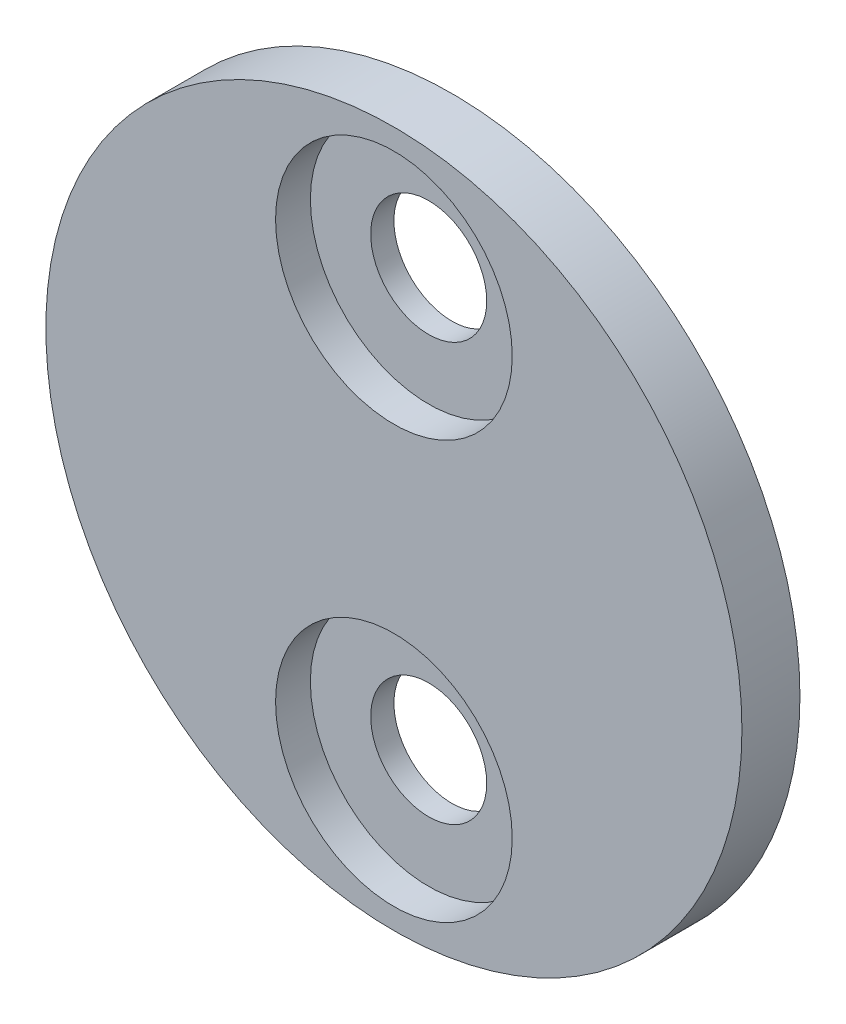
ISO-10303-21;
HEADER;
FILE_DESCRIPTION(('STEP AP214'),'2;1');
FILE_NAME('part.step','',(''),(''),'','','');
FILE_SCHEMA(('AUTOMOTIVE_DESIGN { 1 0 10303 214 1 1 1 1 }'));
ENDSEC;
DATA;
#1=APPLICATION_CONTEXT('core data for automotive mechanical design processes');
#2=APPLICATION_PROTOCOL_DEFINITION('international standard','automotive_design',2000,#1);
#3=PRODUCT_CONTEXT('',#1,'mechanical');
#4=PRODUCT('Part','Part','',(#3));
#5=PRODUCT_RELATED_PRODUCT_CATEGORY('part','',(#4));
#6=PRODUCT_DEFINITION_FORMATION('','',#4);
#7=PRODUCT_DEFINITION_CONTEXT('part definition',#1,'design');
#8=PRODUCT_DEFINITION('design','',#6,#7);
#9=PRODUCT_DEFINITION_SHAPE('','',#8);
#10=(LENGTH_UNIT() NAMED_UNIT(*) SI_UNIT(.MILLI.,.METRE.));
#11=(NAMED_UNIT(*) PLANE_ANGLE_UNIT() SI_UNIT($,.RADIAN.));
#12=(NAMED_UNIT(*) SI_UNIT($,.STERADIAN.) SOLID_ANGLE_UNIT());
#13=UNCERTAINTY_MEASURE_WITH_UNIT(LENGTH_MEASURE(1.E-05),#10,'distance_accuracy_value','');
#14=(GEOMETRIC_REPRESENTATION_CONTEXT(3) GLOBAL_UNCERTAINTY_ASSIGNED_CONTEXT((#13)) GLOBAL_UNIT_ASSIGNED_CONTEXT((#10,
#11,#12)) REPRESENTATION_CONTEXT('',''));
#15=CARTESIAN_POINT('',(0.,0.,0.));
#16=DIRECTION('',(0.,0.,1.));
#17=DIRECTION('',(1.,0.,0.));
#18=AXIS2_PLACEMENT_3D('',#15,#16,#17);
#19=CARTESIAN_POINT('',(0.,0.,6.));
#20=DIRECTION('',(0.,0.,-1.));
#21=DIRECTION('',(-1.,0.,0.));
#22=AXIS2_PLACEMENT_3D('',#19,#20,#21);
#23=CYLINDRICAL_SURFACE('',#22,2.4);
#24=CARTESIAN_POINT('',(0.,0.,0.595876796297115));
#25=DIRECTION('',(0.,0.,1.));
#26=DIRECTION('',(1.,0.,0.));
#27=AXIS2_PLACEMENT_3D('',#24,#25,#26);
#28=CIRCLE('',#27,2.4);
#29=CARTESIAN_POINT('',(2.4,0.,0.595876796297115));
#30=VERTEX_POINT('',#29);
#31=EDGE_CURVE('E54',#30,#30,#28,.T.);
#32=ORIENTED_EDGE('',*,*,#31,.T.);
#33=EDGE_LOOP('',(#32));
#34=FACE_BOUND('',#33,.T.);
#35=CARTESIAN_POINT('',(0.,0.,4.));
#36=DIRECTION('',(0.,0.,1.));
#37=DIRECTION('',(1.,0.,0.));
#38=AXIS2_PLACEMENT_3D('',#35,#36,#37);
#39=CIRCLE('',#38,2.4);
#40=CARTESIAN_POINT('',(2.4,0.,4.));
#41=VERTEX_POINT('',#40);
#42=EDGE_CURVE('E59',#41,#41,#39,.F.);
#43=ORIENTED_EDGE('',*,*,#42,.T.);
#44=EDGE_LOOP('',(#43));
#45=FACE_BOUND('',#44,.T.);
#46=ADVANCED_FACE('F45',(#34,#45),#23,.T.);
#47=CARTESIAN_POINT('',(0.,0.,0.));
#48=DIRECTION('',(0.,0.,1.));
#49=DIRECTION('',(1.,0.,0.));
#50=AXIS2_PLACEMENT_3D('',#47,#48,#49);
#51=PLANE('',#50);
#52=CARTESIAN_POINT('',(0.,0.,0.));
#53=DIRECTION('',(0.,0.,1.));
#54=DIRECTION('',(1.,0.,0.));
#55=AXIS2_PLACEMENT_3D('',#52,#53,#54);
#56=CIRCLE('',#55,1.89999999999999);
#57=CARTESIAN_POINT('',(1.89999999999999,0.,0.));
#58=VERTEX_POINT('',#57);
#59=EDGE_CURVE('E10',#58,#58,#56,.F.);
#60=ORIENTED_EDGE('',*,*,#59,.T.);
#61=EDGE_LOOP('',(#60));
#62=FACE_BOUND('',#61,.T.);
#63=ADVANCED_FACE('F139',(#62),#51,.F.);
#64=CARTESIAN_POINT('',(0.,0.,8.5));
#65=DIRECTION('',(0.,0.,-1.));
#66=DIRECTION('',(-1.,0.,0.));
#67=AXIS2_PLACEMENT_3D('',#64,#65,#66);
#68=CYLINDRICAL_SURFACE('',#67,15.);
#69=CARTESIAN_POINT('',(0.,0.,8.5));
#70=DIRECTION('',(0.,0.,1.));
#71=DIRECTION('',(1.,0.,0.));
#72=AXIS2_PLACEMENT_3D('',#69,#70,#71);
#73=CIRCLE('',#72,15.);
#74=CARTESIAN_POINT('',(15.,0.,8.5));
#75=VERTEX_POINT('',#74);
#76=EDGE_CURVE('E80',#75,#75,#73,.T.);
#77=ORIENTED_EDGE('',*,*,#76,.F.);
#78=EDGE_LOOP('',(#77));
#79=FACE_BOUND('',#78,.T.);
#80=CARTESIAN_POINT('',(0.,0.,6.));
#81=DIRECTION('',(0.,0.,1.));
#82=DIRECTION('',(1.,0.,0.));
#83=AXIS2_PLACEMENT_3D('',#80,#81,#82);
#84=CIRCLE('',#83,15.);
#85=CARTESIAN_POINT('',(15.,0.,6.));
#86=VERTEX_POINT('',#85);
#87=EDGE_CURVE('E81',#86,#86,#84,.T.);
#88=ORIENTED_EDGE('',*,*,#87,.T.);
#89=EDGE_LOOP('',(#88));
#90=FACE_BOUND('',#89,.T.);
#91=ADVANCED_FACE('F132',(#79,#90),#68,.T.);
#92=CARTESIAN_POINT('',(0.,0.,8.5));
#93=DIRECTION('',(0.,0.,1.));
#94=DIRECTION('',(1.,0.,0.));
#95=AXIS2_PLACEMENT_3D('',#92,#93,#94);
#96=PLANE('',#95);
#97=CARTESIAN_POINT('',(0.,9.,8.5));
#98=DIRECTION('',(0.,0.,1.));
#99=DIRECTION('',(1.,0.,0.));
#100=AXIS2_PLACEMENT_3D('',#97,#98,#99);
#101=CIRCLE('',#100,5.1);
#102=CARTESIAN_POINT('',(5.1,9.,8.5));
#103=VERTEX_POINT('',#102);
#104=EDGE_CURVE('E96',#103,#103,#101,.T.);
#105=ORIENTED_EDGE('',*,*,#104,.F.);
#106=EDGE_LOOP('',(#105));
#107=FACE_BOUND('',#106,.T.);
#108=CARTESIAN_POINT('',(0.,-9.,8.5));
#109=DIRECTION('',(0.,0.,1.));
#110=DIRECTION('',(1.,0.,0.));
#111=AXIS2_PLACEMENT_3D('',#108,#109,#110);
#112=CIRCLE('',#111,5.1);
#113=CARTESIAN_POINT('',(5.1,-9.,8.5));
#114=VERTEX_POINT('',#113);
#115=EDGE_CURVE('E71',#114,#114,#112,.T.);
#116=ORIENTED_EDGE('',*,*,#115,.F.);
#117=EDGE_LOOP('',(#116));
#118=FACE_BOUND('',#117,.T.);
#119=ORIENTED_EDGE('',*,*,#76,.T.);
#120=EDGE_LOOP('',(#119));
#121=FACE_BOUND('',#120,.T.);
#122=ADVANCED_FACE('F128',(#107,#118,#121),#96,.T.);
#123=CARTESIAN_POINT('',(0.,0.,6.));
#124=DIRECTION('',(0.,0.,1.));
#125=DIRECTION('',(1.,0.,0.));
#126=AXIS2_PLACEMENT_3D('',#123,#124,#125);
#127=PLANE('',#126);
#128=CARTESIAN_POINT('',(0.,-9.,6.));
#129=DIRECTION('',(0.,0.,1.));
#130=DIRECTION('',(1.,0.,0.));
#131=AXIS2_PLACEMENT_3D('',#128,#129,#130);
#132=CIRCLE('',#131,2.5);
#133=CARTESIAN_POINT('',(2.5,-9.,6.));
#134=VERTEX_POINT('',#133);
#135=EDGE_CURVE('E67',#134,#134,#132,.T.);
#136=ORIENTED_EDGE('',*,*,#135,.T.);
#137=EDGE_LOOP('',(#136));
#138=FACE_BOUND('',#137,.T.);
#139=CARTESIAN_POINT('',(0.,9.,6.));
#140=DIRECTION('',(0.,0.,1.));
#141=DIRECTION('',(1.,0.,0.));
#142=AXIS2_PLACEMENT_3D('',#139,#140,#141);
#143=CIRCLE('',#142,2.5);
#144=CARTESIAN_POINT('',(2.5,9.,6.));
#145=VERTEX_POINT('',#144);
#146=EDGE_CURVE('E72',#145,#145,#143,.T.);
#147=ORIENTED_EDGE('',*,*,#146,.T.);
#148=EDGE_LOOP('',(#147));
#149=FACE_BOUND('',#148,.T.);
#150=CARTESIAN_POINT('',(0.,0.,6.));
#151=DIRECTION('',(0.,0.,1.));
#152=DIRECTION('',(1.,0.,0.));
#153=AXIS2_PLACEMENT_3D('',#150,#151,#152);
#154=CIRCLE('',#153,4.4);
#155=CARTESIAN_POINT('',(4.4,0.,6.));
#156=VERTEX_POINT('',#155);
#157=EDGE_CURVE('E64',#156,#156,#154,.T.);
#158=ORIENTED_EDGE('',*,*,#157,.T.);
#159=EDGE_LOOP('',(#158));
#160=FACE_BOUND('',#159,.T.);
#161=ORIENTED_EDGE('',*,*,#87,.F.);
#162=EDGE_LOOP('',(#161));
#163=FACE_BOUND('',#162,.T.);
#164=ADVANCED_FACE('F131',(#138,#149,#160,#163),#127,.F.);
#165=CARTESIAN_POINT('',(0.,0.,4.));
#166=DIRECTION('',(0.,0.,1.));
#167=DIRECTION('',(1.,0.,0.));
#168=AXIS2_PLACEMENT_3D('',#165,#166,#167);
#169=TOROIDAL_SURFACE('',#168,4.4,2.);
#170=ORIENTED_EDGE('',*,*,#42,.F.);
#171=EDGE_LOOP('',(#170));
#172=FACE_BOUND('',#171,.T.);
#173=ORIENTED_EDGE('',*,*,#157,.F.);
#174=EDGE_LOOP('',(#173));
#175=FACE_BOUND('',#174,.T.);
#176=ADVANCED_FACE('F124',(#172,#175),#169,.F.);
#177=CARTESIAN_POINT('',(0.,-9.,7.));
#178=DIRECTION('',(0.,0.,1.));
#179=DIRECTION('',(1.,0.,0.));
#180=AXIS2_PLACEMENT_3D('',#177,#178,#179);
#181=CYLINDRICAL_SURFACE('',#180,5.1);
#182=CARTESIAN_POINT('',(0.,-9.,7.));
#183=DIRECTION('',(0.,0.,1.));
#184=DIRECTION('',(1.,0.,0.));
#185=AXIS2_PLACEMENT_3D('',#182,#183,#184);
#186=CIRCLE('',#185,5.1);
#187=CARTESIAN_POINT('',(5.1,-9.,7.));
#188=VERTEX_POINT('',#187);
#189=EDGE_CURVE('E92',#188,#188,#186,.T.);
#190=ORIENTED_EDGE('',*,*,#189,.F.);
#191=EDGE_LOOP('',(#190));
#192=FACE_BOUND('',#191,.T.);
#193=ORIENTED_EDGE('',*,*,#115,.T.);
#194=EDGE_LOOP('',(#193));
#195=FACE_BOUND('',#194,.T.);
#196=ADVANCED_FACE('F118',(#192,#195),#181,.F.);
#197=CARTESIAN_POINT('',(0.,0.,7.));
#198=DIRECTION('',(0.,0.,1.));
#199=DIRECTION('',(1.,0.,0.));
#200=AXIS2_PLACEMENT_3D('',#197,#198,#199);
#201=PLANE('',#200);
#202=CARTESIAN_POINT('',(0.,-9.,7.));
#203=DIRECTION('',(0.,0.,1.));
#204=DIRECTION('',(1.,0.,0.));
#205=AXIS2_PLACEMENT_3D('',#202,#203,#204);
#206=CIRCLE('',#205,2.5);
#207=CARTESIAN_POINT('',(2.5,-9.,7.));
#208=VERTEX_POINT('',#207);
#209=EDGE_CURVE('E75',#208,#208,#206,.T.);
#210=ORIENTED_EDGE('',*,*,#209,.F.);
#211=EDGE_LOOP('',(#210));
#212=FACE_BOUND('',#211,.T.);
#213=ORIENTED_EDGE('',*,*,#189,.T.);
#214=EDGE_LOOP('',(#213));
#215=FACE_BOUND('',#214,.T.);
#216=ADVANCED_FACE('F114',(#212,#215),#201,.T.);
#217=CARTESIAN_POINT('',(0.,9.,7.));
#218=DIRECTION('',(0.,0.,1.));
#219=DIRECTION('',(1.,0.,0.));
#220=AXIS2_PLACEMENT_3D('',#217,#218,#219);
#221=CYLINDRICAL_SURFACE('',#220,5.1);
#222=CARTESIAN_POINT('',(0.,9.,7.));
#223=DIRECTION('',(0.,0.,1.));
#224=DIRECTION('',(1.,0.,0.));
#225=AXIS2_PLACEMENT_3D('',#222,#223,#224);
#226=CIRCLE('',#225,5.1);
#227=CARTESIAN_POINT('',(5.1,9.,7.));
#228=VERTEX_POINT('',#227);
#229=EDGE_CURVE('E85',#228,#228,#226,.T.);
#230=ORIENTED_EDGE('',*,*,#229,.F.);
#231=EDGE_LOOP('',(#230));
#232=FACE_BOUND('',#231,.T.);
#233=ORIENTED_EDGE('',*,*,#104,.T.);
#234=EDGE_LOOP('',(#233));
#235=FACE_BOUND('',#234,.T.);
#236=ADVANCED_FACE('F117',(#232,#235),#221,.F.);
#237=CARTESIAN_POINT('',(0.,0.,7.));
#238=DIRECTION('',(0.,0.,1.));
#239=DIRECTION('',(1.,0.,0.));
#240=AXIS2_PLACEMENT_3D('',#237,#238,#239);
#241=PLANE('',#240);
#242=CARTESIAN_POINT('',(0.,9.,7.));
#243=DIRECTION('',(0.,0.,1.));
#244=DIRECTION('',(1.,0.,0.));
#245=AXIS2_PLACEMENT_3D('',#242,#243,#244);
#246=CIRCLE('',#245,2.5);
#247=CARTESIAN_POINT('',(2.5,9.,7.));
#248=VERTEX_POINT('',#247);
#249=EDGE_CURVE('E103',#248,#248,#246,.T.);
#250=ORIENTED_EDGE('',*,*,#249,.F.);
#251=EDGE_LOOP('',(#250));
#252=FACE_BOUND('',#251,.T.);
#253=ORIENTED_EDGE('',*,*,#229,.T.);
#254=EDGE_LOOP('',(#253));
#255=FACE_BOUND('',#254,.T.);
#256=ADVANCED_FACE('F204',(#252,#255),#241,.T.);
#257=CARTESIAN_POINT('',(0.,9.,0.));
#258=DIRECTION('',(0.,0.,1.));
#259=DIRECTION('',(1.,0.,0.));
#260=AXIS2_PLACEMENT_3D('',#257,#258,#259);
#261=CYLINDRICAL_SURFACE('',#260,2.5);
#262=ORIENTED_EDGE('',*,*,#249,.T.);
#263=EDGE_LOOP('',(#262));
#264=FACE_BOUND('',#263,.T.);
#265=ORIENTED_EDGE('',*,*,#146,.F.);
#266=EDGE_LOOP('',(#265));
#267=FACE_BOUND('',#266,.T.);
#268=ADVANCED_FACE('F213',(#264,#267),#261,.F.);
#269=CARTESIAN_POINT('',(0.,-9.,0.));
#270=DIRECTION('',(0.,0.,1.));
#271=DIRECTION('',(1.,0.,0.));
#272=AXIS2_PLACEMENT_3D('',#269,#270,#271);
#273=CYLINDRICAL_SURFACE('',#272,2.5);
#274=ORIENTED_EDGE('',*,*,#209,.T.);
#275=EDGE_LOOP('',(#274));
#276=FACE_BOUND('',#275,.T.);
#277=ORIENTED_EDGE('',*,*,#135,.F.);
#278=EDGE_LOOP('',(#277));
#279=FACE_BOUND('',#278,.T.);
#280=ADVANCED_FACE('F111',(#276,#279),#273,.F.);
#281=CARTESIAN_POINT('',(0.,0.,0.595876796297115));
#282=DIRECTION('',(0.,0.,1.));
#283=DIRECTION('',(1.,0.,0.));
#284=AXIS2_PLACEMENT_3D('',#281,#282,#283);
#285=CONICAL_SURFACE('',#284,2.4,0.698131700797731);
#286=CARTESIAN_POINT('',(1.89999999999999,0.,0.));
#287=CARTESIAN_POINT('',(1.90520833333333,0.,0.00620704996142823));
#288=CARTESIAN_POINT('',(1.91041666666666,0.,0.0124140999228565));
#289=CARTESIAN_POINT('',(1.92083333333333,0.,0.0248281998457131));
#290=CARTESIAN_POINT('',(1.92604166666666,0.,0.0310352498071413));
#291=CARTESIAN_POINT('',(1.93645833333333,0.,0.0434493497299979));
#292=CARTESIAN_POINT('',(1.94166666666666,0.,0.0496563996914263));
#293=CARTESIAN_POINT('',(1.95208333333333,0.,0.0620704996142828));
#294=CARTESIAN_POINT('',(1.95729166666666,0.,0.068277549575711));
#295=CARTESIAN_POINT('',(1.96770833333333,0.,0.0806916494985676));
#296=CARTESIAN_POINT('',(1.97291666666666,0.,0.086898699459996));
#297=CARTESIAN_POINT('',(1.98333333333333,0.,0.0993127993828525));
#298=CARTESIAN_POINT('',(1.98854166666666,0.,0.105519849344281));
#299=CARTESIAN_POINT('',(1.99895833333333,0.,0.117933949267137));
#300=CARTESIAN_POINT('',(2.00416666666666,0.,0.124140999228566));
#301=CARTESIAN_POINT('',(2.01458333333333,0.,0.136555099151422));
#302=CARTESIAN_POINT('',(2.01979166666666,0.,0.14276214911285));
#303=CARTESIAN_POINT('',(2.03020833333333,0.,0.155176249035707));
#304=CARTESIAN_POINT('',(2.03541666666666,0.,0.161383298997135));
#305=CARTESIAN_POINT('',(2.04583333333333,0.,0.173797398919992));
#306=CARTESIAN_POINT('',(2.05104166666666,0.,0.18000444888142));
#307=CARTESIAN_POINT('',(2.06145833333333,0.,0.192418548804277));
#308=CARTESIAN_POINT('',(2.06666666666666,0.,0.198625598765705));
#309=CARTESIAN_POINT('',(2.07708333333333,0.,0.211039698688562));
#310=CARTESIAN_POINT('',(2.08229166666666,0.,0.21724674864999));
#311=CARTESIAN_POINT('',(2.09270833333333,0.,0.229660848572846));
#312=CARTESIAN_POINT('',(2.09791666666666,0.,0.235867898534275));
#313=CARTESIAN_POINT('',(2.10833333333333,0.,0.248281998457131));
#314=CARTESIAN_POINT('',(2.11354166666666,0.,0.25448904841856));
#315=CARTESIAN_POINT('',(2.12395833333333,0.,0.266903148341416));
#316=CARTESIAN_POINT('',(2.12916666666666,0.,0.273110198302844));
#317=CARTESIAN_POINT('',(2.13958333333333,0.,0.285524298225701));
#318=CARTESIAN_POINT('',(2.14479166666666,0.,0.291731348187129));
#319=CARTESIAN_POINT('',(2.15520833333333,0.,0.304145448109986));
#320=CARTESIAN_POINT('',(2.16041666666666,0.,0.310352498071414));
#321=CARTESIAN_POINT('',(2.17083333333333,0.,0.322766597994271));
#322=CARTESIAN_POINT('',(2.17604166666666,0.,0.328973647955699));
#323=CARTESIAN_POINT('',(2.18645833333333,0.,0.341387747878556));
#324=CARTESIAN_POINT('',(2.19166666666666,0.,0.347594797839984));
#325=CARTESIAN_POINT('',(2.20208333333333,0.,0.36000889776284));
#326=CARTESIAN_POINT('',(2.20729166666666,0.,0.366215947724269));
#327=CARTESIAN_POINT('',(2.21770833333333,0.,0.378630047647125));
#328=CARTESIAN_POINT('',(2.22291666666666,0.,0.384837097608554));
#329=CARTESIAN_POINT('',(2.23333333333333,0.,0.39725119753141));
#330=CARTESIAN_POINT('',(2.23854166666666,0.,0.403458247492838));
#331=CARTESIAN_POINT('',(2.24895833333333,0.,0.415872347415695));
#332=CARTESIAN_POINT('',(2.25416666666666,0.,0.422079397377123));
#333=CARTESIAN_POINT('',(2.26458333333333,0.,0.43449349729998));
#334=CARTESIAN_POINT('',(2.26979166666666,0.,0.440700547261408));
#335=CARTESIAN_POINT('',(2.28020833333333,0.,0.453114647184265));
#336=CARTESIAN_POINT('',(2.28541666666666,0.,0.459321697145693));
#337=CARTESIAN_POINT('',(2.29583333333333,0.,0.47173579706855));
#338=CARTESIAN_POINT('',(2.30104166666666,0.,0.477942847029978));
#339=CARTESIAN_POINT('',(2.31145833333333,0.,0.490356946952834));
#340=CARTESIAN_POINT('',(2.31666666666667,0.,0.496563996914263));
#341=CARTESIAN_POINT('',(2.32708333333333,0.,0.508978096837119));
#342=CARTESIAN_POINT('',(2.33229166666667,0.,0.515185146798548));
#343=CARTESIAN_POINT('',(2.34270833333333,0.,0.527599246721404));
#344=CARTESIAN_POINT('',(2.34791666666667,0.,0.533806296682832));
#345=CARTESIAN_POINT('',(2.35833333333333,0.,0.546220396605689));
#346=CARTESIAN_POINT('',(2.36354166666667,0.,0.552427446567117));
#347=CARTESIAN_POINT('',(2.37395833333333,0.,0.564841546489974));
#348=CARTESIAN_POINT('',(2.37916666666667,0.,0.571048596451402));
#349=CARTESIAN_POINT('',(2.38958333333333,0.,0.583462696374259));
#350=CARTESIAN_POINT('',(2.39479166666667,0.,0.589669746335687));
#351=CARTESIAN_POINT('',(2.4,0.,0.595876796297115));
#352=B_SPLINE_CURVE_WITH_KNOTS('',3,(#286,#287,#288,#289,#290,#291,#292,#293,#294,#295,#296,
#297,#298,#299,#300,#301,#302,#303,#304,#305,#306,#307,#308,#309,#310,#311,#312,#313,#314,#315,
#316,#317,#318,#319,#320,#321,#322,#323,#324,#325,#326,#327,#328,#329,#330,#331,#332,#333,#334,
#335,#336,#337,#338,#339,#340,#341,#342,#343,#344,#345,#346,#347,#348,#349,#350,#351),
.UNSPECIFIED.,.F.,.F.,(4,2,2,2,2,2,2,2,2,2,2,2,2,2,2,2,2,2,2,2,2,2,2,2,2,2,2,2,2,2,2,2,4),(0.,
0.0243081847946944,0.0486163695893887,0.0729245543840831,0.0972327391787775,0.121540923973472,
0.145849108768166,0.17015729356286,0.194465478357555,0.218773663152249,0.243081847946943,
0.267390032741638,0.291698217536332,0.316006402331027,0.340314587125721,0.364622771920415,
0.38893095671511,0.413239141509804,0.437547326304498,0.461855511099193,0.486163695893887,
0.510471880688581,0.534780065483276,0.55908825027797,0.583396435072665,0.607704619867359,
0.632012804662053,0.656320989456747,0.680629174251442,0.704937359046136,0.729245543840831,
0.753553728635525,0.777861913430219),.UNSPECIFIED.);
#353=EDGE_CURVE('BSEAM48',#58,#30,#352,.T.);
#354=ORIENTED_EDGE('',*,*,#59,.F.);
#355=ORIENTED_EDGE('',*,*,#31,.F.);
#356=ORIENTED_EDGE('',*,*,#353,.T.);
#357=ORIENTED_EDGE('',*,*,#353,.F.);
#358=EDGE_LOOP('',(#354,#356,#355,#357));
#359=FACE_BOUND('',#358,.T.);
#360=ADVANCED_FACE('F48',(#359),#285,.T.);
#361=CLOSED_SHELL('',(#46,#63,#91,#122,#164,#176,#196,#216,#236,#256,#268,#280,#360));
#362=MANIFOLD_SOLID_BREP('B2',#361);
#363=ADVANCED_BREP_SHAPE_REPRESENTATION('',(#18,#362),#14);
#364=SHAPE_DEFINITION_REPRESENTATION(#9,#363);
ENDSEC;
END-ISO-10303-21;
